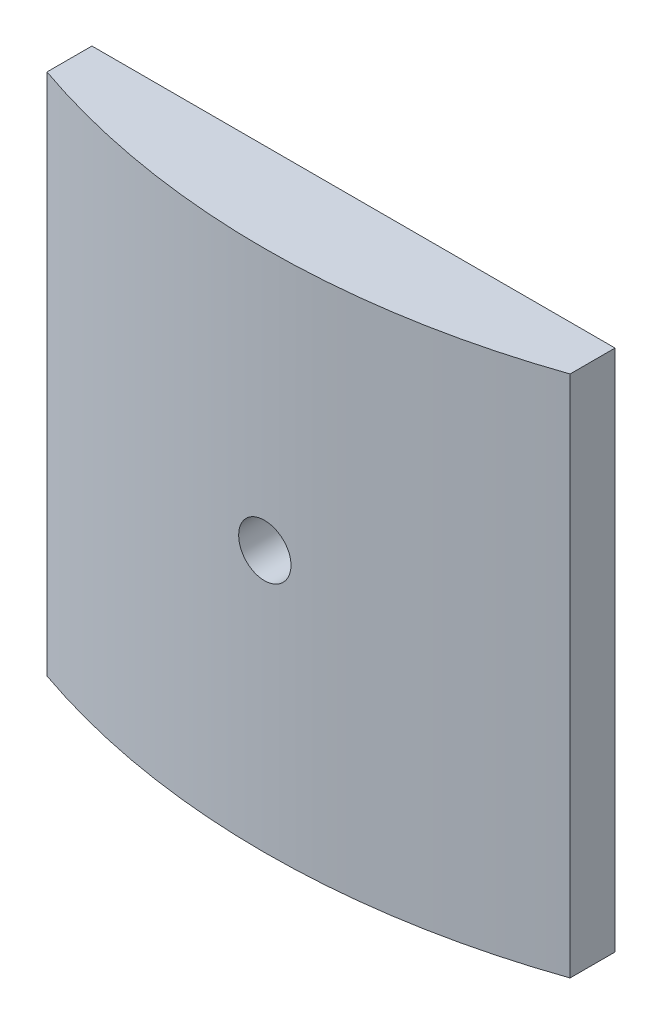
ISO-10303-21;
HEADER;
FILE_DESCRIPTION(('STEP AP214'),'2;1');
FILE_NAME('part.step','',(''),(''),'','','');
FILE_SCHEMA(('AUTOMOTIVE_DESIGN { 1 0 10303 214 1 1 1 1 }'));
ENDSEC;
DATA;
#1=APPLICATION_CONTEXT('core data for automotive mechanical design processes');
#2=APPLICATION_PROTOCOL_DEFINITION('international standard','automotive_design',2000,#1);
#3=PRODUCT_CONTEXT('',#1,'mechanical');
#4=PRODUCT('Part','Part','',(#3));
#5=PRODUCT_RELATED_PRODUCT_CATEGORY('part','',(#4));
#6=PRODUCT_DEFINITION_FORMATION('','',#4);
#7=PRODUCT_DEFINITION_CONTEXT('part definition',#1,'design');
#8=PRODUCT_DEFINITION('design','',#6,#7);
#9=PRODUCT_DEFINITION_SHAPE('','',#8);
#10=(LENGTH_UNIT() NAMED_UNIT(*) SI_UNIT(.MILLI.,.METRE.));
#11=(NAMED_UNIT(*) PLANE_ANGLE_UNIT() SI_UNIT($,.RADIAN.));
#12=(NAMED_UNIT(*) SI_UNIT($,.STERADIAN.) SOLID_ANGLE_UNIT());
#13=UNCERTAINTY_MEASURE_WITH_UNIT(LENGTH_MEASURE(1.E-05),#10,'distance_accuracy_value','');
#14=(GEOMETRIC_REPRESENTATION_CONTEXT(3) GLOBAL_UNCERTAINTY_ASSIGNED_CONTEXT((#13)) GLOBAL_UNIT_ASSIGNED_CONTEXT((#10,
#11,#12)) REPRESENTATION_CONTEXT('',''));
#15=CARTESIAN_POINT('',(0.,0.,0.));
#16=DIRECTION('',(0.,0.,1.));
#17=DIRECTION('',(1.,0.,0.));
#18=AXIS2_PLACEMENT_3D('',#15,#16,#17);
#19=CARTESIAN_POINT('',(0.,25.,33.8431677004384));
#20=DIRECTION('',(0.,0.,1.));
#21=DIRECTION('',(1.,0.,0.));
#22=AXIS2_PLACEMENT_3D('',#19,#20,#21);
#23=PLANE('',#22);
#24=CARTESIAN_POINT('',(0.,12.5,33.8431677004384));
#25=DIRECTION('',(0.,0.,-1.));
#26=DIRECTION('',(-1.,0.,0.));
#27=AXIS2_PLACEMENT_3D('',#24,#25,#26);
#28=CIRCLE('',#27,1.25);
#29=CARTESIAN_POINT('',(-1.25,12.5,33.8431677004384));
#30=VERTEX_POINT('',#29);
#31=EDGE_CURVE('E142',#30,#30,#28,.T.);
#32=ORIENTED_EDGE('',*,*,#31,.F.);
#33=EDGE_LOOP('',(#32));
#34=FACE_BOUND('',#33,.T.);
#35=DIRECTION('',(-1.,0.,0.));
#36=VECTOR('',#35,1.);
#37=CARTESIAN_POINT('',(0.,0.,33.8431677004384));
#38=LINE('',#37,#36);
#39=CARTESIAN_POINT('',(12.5,0.,33.8431677004384));
#40=VERTEX_POINT('',#39);
#41=CARTESIAN_POINT('',(-12.5,0.,33.8431677004384));
#42=VERTEX_POINT('',#41);
#43=EDGE_CURVE('E79',#40,#42,#38,.T.);
#44=ORIENTED_EDGE('',*,*,#43,.T.);
#45=DIRECTION('',(0.,-1.,0.));
#46=VECTOR('',#45,1.);
#47=CARTESIAN_POINT('',(-12.5,25.,33.8431677004384));
#48=LINE('',#47,#46);
#49=CARTESIAN_POINT('',(-12.5,25.,33.8431677004384));
#50=VERTEX_POINT('',#49);
#51=EDGE_CURVE('E11',#50,#42,#48,.T.);
#52=ORIENTED_EDGE('',*,*,#51,.F.);
#53=DIRECTION('',(1.,0.,0.));
#54=VECTOR('',#53,1.);
#55=CARTESIAN_POINT('',(0.,25.,33.8431677004384));
#56=LINE('',#55,#54);
#57=CARTESIAN_POINT('',(12.5,25.,33.8431677004384));
#58=VERTEX_POINT('',#57);
#59=EDGE_CURVE('E57',#50,#58,#56,.T.);
#60=ORIENTED_EDGE('',*,*,#59,.T.);
#61=DIRECTION('',(0.,-1.,0.));
#62=VECTOR('',#61,1.);
#63=CARTESIAN_POINT('',(12.5,25.,33.8431677004384));
#64=LINE('',#63,#62);
#65=EDGE_CURVE('E85',#58,#40,#64,.T.);
#66=ORIENTED_EDGE('',*,*,#65,.T.);
#67=EDGE_LOOP('',(#44,#52,#60,#66));
#68=FACE_BOUND('',#67,.T.);
#69=ADVANCED_FACE('F34',(#34,#68),#23,.F.);
#70=CARTESIAN_POINT('',(-12.5,25.,33.8431677004384));
#71=DIRECTION('',(1.,0.,0.));
#72=DIRECTION('',(0.,0.,-1.));
#73=AXIS2_PLACEMENT_3D('',#70,#71,#72);
#74=PLANE('',#73);
#75=DIRECTION('',(0.,0.,1.));
#76=VECTOR('',#75,1.);
#77=CARTESIAN_POINT('',(-12.5,0.,33.8431677004384));
#78=LINE('',#77,#76);
#79=CARTESIAN_POINT('',(-12.5,0.,35.9911100134464));
#80=VERTEX_POINT('',#79);
#81=EDGE_CURVE('E73',#42,#80,#78,.T.);
#82=ORIENTED_EDGE('',*,*,#81,.T.);
#83=DIRECTION('',(0.,-1.,0.));
#84=VECTOR('',#83,1.);
#85=CARTESIAN_POINT('',(-12.5,25.,35.9911100134464));
#86=LINE('',#85,#84);
#87=CARTESIAN_POINT('',(-12.5,25.,35.9911100134464));
#88=VERTEX_POINT('',#87);
#89=EDGE_CURVE('E48',#88,#80,#86,.T.);
#90=ORIENTED_EDGE('',*,*,#89,.F.);
#91=DIRECTION('',(0.,0.,1.));
#92=VECTOR('',#91,1.);
#93=CARTESIAN_POINT('',(-12.5,25.,33.8431677004384));
#94=LINE('',#93,#92);
#95=EDGE_CURVE('E93',#50,#88,#94,.T.);
#96=ORIENTED_EDGE('',*,*,#95,.F.);
#97=ORIENTED_EDGE('',*,*,#51,.T.);
#98=EDGE_LOOP('',(#82,#90,#96,#97));
#99=FACE_BOUND('',#98,.T.);
#100=ADVANCED_FACE('F126',(#99),#74,.F.);
#101=CARTESIAN_POINT('',(0.,25.,0.));
#102=DIRECTION('',(0.,-1.,0.));
#103=DIRECTION('',(0.,0.,-1.));
#104=AXIS2_PLACEMENT_3D('',#101,#102,#103);
#105=CYLINDRICAL_SURFACE('',#104,38.1);
#106=CARTESIAN_POINT('',(-1.25,12.5,38.0794892297678));
#107=CARTESIAN_POINT('',(-1.24999689344927,12.5701927734578,38.0794895063849));
#108=CARTESIAN_POINT('',(-1.24406772236094,12.6404359623947,38.079685396581));
#109=CARTESIAN_POINT('',(-1.22049813975321,12.7789864153585,38.0804479747923));
#110=CARTESIAN_POINT('',(-1.20284376004188,12.8472912689325,38.0810151050525));
#111=CARTESIAN_POINT('',(-1.15632812886405,12.9799378419878,38.0824558505276));
#112=CARTESIAN_POINT('',(-1.12747238530295,13.0442814912742,38.0833293150923));
#113=CARTESIAN_POINT('',(-1.05938109702831,13.1671935793335,38.0852841149171));
#114=CARTESIAN_POINT('',(-1.02014807690055,13.2257634180093,38.0863653996013));
#115=CARTESIAN_POINT('',(-0.932392363094115,13.3355135692366,38.0886146517612));
#116=CARTESIAN_POINT('',(-0.883865581024258,13.386690612199,38.0897826572468));
#117=CARTESIAN_POINT('',(-0.778907196717022,13.4801748595524,38.0920733630286));
#118=CARTESIAN_POINT('',(-0.722475278977218,13.5224817097561,38.0931960615141));
#119=CARTESIAN_POINT('',(-0.603295323037102,13.5970305716487,38.0952698129786));
#120=CARTESIAN_POINT('',(-0.540545980172142,13.6292704986706,38.0962208303886));
#121=CARTESIAN_POINT('',(-0.410521672323604,13.6827568195886,38.0978437043333));
#122=CARTESIAN_POINT('',(-0.343246727257202,13.7040032618634,38.0985155620966));
#123=CARTESIAN_POINT('',(-0.206106743775832,13.7348921365735,38.0995041678566));
#124=CARTESIAN_POINT('',(-0.136242654044698,13.7445387767749,38.099821044618));
#125=CARTESIAN_POINT('',(0.00411393517043274,13.7519671818899,38.1000644015011));
#126=CARTESIAN_POINT('',(0.0746064318771283,13.7497489992151,38.0999908833473));
#127=CARTESIAN_POINT('',(0.214190309590404,13.7335142656904,38.0994618472448));
#128=CARTESIAN_POINT('',(0.283282219261826,13.7195022547728,38.0990064762874));
#129=CARTESIAN_POINT('',(0.418132590407426,13.6800846398356,38.0977652221604));
#130=CARTESIAN_POINT('',(0.483891043817069,13.6546790082532,38.0969793381914));
#131=CARTESIAN_POINT('',(0.610222468469295,13.5931901210389,38.0951653725609));
#132=CARTESIAN_POINT('',(0.670794427031711,13.5571047862617,38.0941372437467));
#133=CARTESIAN_POINT('',(0.785022342438854,13.4752823652743,38.0919546466782));
#134=CARTESIAN_POINT('',(0.838678279832809,13.4295452519203,38.0908001780686));
#135=CARTESIAN_POINT('',(0.937577524429711,13.329691889258,38.0884943534772));
#136=CARTESIAN_POINT('',(0.982816854648363,13.2755717008317,38.0873429992189));
#137=CARTESIAN_POINT('',(1.0635680837801,13.1605023514975,38.0851737551116));
#138=CARTESIAN_POINT('',(1.09907998100811,13.0995531894065,38.0841558652856));
#139=CARTESIAN_POINT('',(1.15936786526613,12.9725537668527,38.0823683650203));
#140=CARTESIAN_POINT('',(1.18414372110389,12.9065034440664,38.0815987576149));
#141=CARTESIAN_POINT('',(1.22225365417844,12.7711776551496,38.0803947278455));
#142=CARTESIAN_POINT('',(1.23558776864052,12.7019021995129,38.0799603043911));
#143=CARTESIAN_POINT('',(1.2504308273659,12.5621272332675,38.0794758249499));
#144=CARTESIAN_POINT('',(1.25194528242318,12.4916283084568,38.0794255898394));
#145=CARTESIAN_POINT('',(1.24312039549198,12.3513772238387,38.0797146841326));
#146=CARTESIAN_POINT('',(1.23278107004136,12.2816250629897,38.0800540129927));
#147=CARTESIAN_POINT('',(1.2005466833781,12.1448629104064,38.0810838201937));
#148=CARTESIAN_POINT('',(1.1786541284927,12.0778523273176,38.0817742223725));
#149=CARTESIAN_POINT('',(1.12393727505231,11.9484573583007,38.0834282839864));
#150=CARTESIAN_POINT('',(1.09111294993041,11.8860729836158,38.0843919440856));
#151=CARTESIAN_POINT('',(1.01545012450859,11.7676759201583,38.0864843276862));
#152=CARTESIAN_POINT('',(0.97260791372582,11.7116656037019,38.0876131122894));
#153=CARTESIAN_POINT('',(0.878130896547097,11.6076304199389,38.0899082825431));
#154=CARTESIAN_POINT('',(0.82649606399705,11.5596055763863,38.0910746683056));
#155=CARTESIAN_POINT('',(0.715875920306643,11.4728861865969,38.0933140780645));
#156=CARTESIAN_POINT('',(0.656887821976872,11.4341951946829,38.0943870663963));
#157=CARTESIAN_POINT('',(0.533249810531847,11.3672661052514,38.0963182224865));
#158=CARTESIAN_POINT('',(0.468599911491139,11.3390279817502,38.097176390779));
#159=CARTESIAN_POINT('',(0.335486853934177,11.2938124389483,38.0985810007933));
#160=CARTESIAN_POINT('',(0.267024477202984,11.2768327201537,38.0991275061681));
#161=CARTESIAN_POINT('',(0.128218801169198,11.2546084389633,38.0998474393724));
#162=CARTESIAN_POINT('',(0.0578755045012822,11.2493638601305,38.1000208677245));
#163=CARTESIAN_POINT('',(-0.0826597307080741,11.250758994247,38.0999751017181));
#164=CARTESIAN_POINT('',(-0.152851724930558,11.2573931113618,38.0997560922297));
#165=CARTESIAN_POINT('',(-0.291125056489619,11.2823458013631,38.0989504887732));
#166=CARTESIAN_POINT('',(-0.35920638966508,11.3006643972838,38.0983638940806));
#167=CARTESIAN_POINT('',(-0.491327745402702,11.3484651926155,38.0968891843443));
#168=CARTESIAN_POINT('',(-0.555367703124306,11.3779475710873,38.0960010644644));
#169=CARTESIAN_POINT('',(-0.677587832579731,11.4472373455121,38.0940233524452));
#170=CARTESIAN_POINT('',(-0.735768212581943,11.4870443743137,38.0929337674705));
#171=CARTESIAN_POINT('',(-0.844643938026922,11.5758708482309,38.0906753452437));
#172=CARTESIAN_POINT('',(-0.895336548619527,11.6248936445502,38.0895064792611));
#173=CARTESIAN_POINT('',(-0.987786333821405,11.730768127002,38.0872212544327));
#174=CARTESIAN_POINT('',(-1.02954129435809,11.7876217473,38.0861049086509));
#175=CARTESIAN_POINT('',(-1.10293897097257,11.9075687174504,38.0840501911309));
#176=CARTESIAN_POINT('',(-1.13457476763535,11.9706662984406,38.0831119413512));
#177=CARTESIAN_POINT('',(-1.18676683586568,12.1012317784712,38.0815214076304));
#178=CARTESIAN_POINT('',(-1.20733630570789,12.1686943634719,38.0808687832118));
#179=CARTESIAN_POINT('',(-1.23136685362295,12.2804852826643,38.080097364937));
#180=CARTESIAN_POINT('',(-1.23834547727532,12.3240881636997,38.0798703066668));
#181=CARTESIAN_POINT('',(-1.24766302587708,12.411787391665,38.0795661521816));
#182=CARTESIAN_POINT('',(-1.25000195247171,12.4558837384199,38.0794890559135));
#183=CARTESIAN_POINT('',(-1.25,12.5,38.0794892297678));
#184=B_SPLINE_CURVE_WITH_KNOTS('',3,(#106,#107,#108,#109,#110,#111,#112,#113,#114,#115,#116,
#117,#118,#119,#120,#121,#122,#123,#124,#125,#126,#127,#128,#129,#130,#131,#132,#133,#134,#135,
#136,#137,#138,#139,#140,#141,#142,#143,#144,#145,#146,#147,#148,#149,#150,#151,#152,#153,#154,
#155,#156,#157,#158,#159,#160,#161,#162,#163,#164,#165,#166,#167,#168,#169,#170,#171,#172,#173,
#174,#175,#176,#177,#178,#179,#180,#181,#182,#183),.UNSPECIFIED.,.T.,.F.,(4,2,2,2,2,2,2,2,2,2,2,
2,2,2,2,2,2,2,2,2,2,2,2,2,2,2,2,2,2,2,2,2,2,2,2,2,2,2,4),(0.,0.210417289012688,
0.421085697968228,0.631650648553526,0.842164419898711,1.05277101133123,1.26338601069433,
1.47404459550628,1.6847022532704,1.89528347302246,2.10586376255282,2.31636302807069,
2.52686280281906,2.73740358506049,2.94794495941862,3.15858556673856,3.36922621054749,
3.57986942826986,3.7905119606694,4.00105627729577,4.21160030018056,4.42209866696288,
4.63259754531225,4.84317451330589,5.05375210768233,5.26440976369969,5.47506689606269,
5.68568098910191,5.89629478714134,6.10680939500792,6.31732441787244,6.52784281741967,
6.73835373181774,6.94894134459004,7.15958106479881,7.3703645126145,7.58089600871995,
7.71314363190767,7.84539120820048),.UNSPECIFIED.);
#185=CARTESIAN_POINT('',(-1.25,12.5,38.0794892297678));
#186=VERTEX_POINT('',#185);
#187=EDGE_CURVE('E38',#186,#186,#184,.T.);
#188=ORIENTED_EDGE('',*,*,#187,.T.);
#189=EDGE_LOOP('',(#188));
#190=FACE_BOUND('',#189,.T.);
#191=CARTESIAN_POINT('',(0.,0.,0.));
#192=DIRECTION('',(0.,1.,0.));
#193=DIRECTION('',(0.,0.,1.));
#194=AXIS2_PLACEMENT_3D('',#191,#192,#193);
#195=CIRCLE('',#194,38.1);
#196=CARTESIAN_POINT('',(12.5,0.,35.9911100134464));
#197=VERTEX_POINT('',#196);
#198=EDGE_CURVE('E100',#80,#197,#195,.T.);
#199=ORIENTED_EDGE('',*,*,#198,.T.);
#200=DIRECTION('',(0.,-1.,0.));
#201=VECTOR('',#200,1.);
#202=CARTESIAN_POINT('',(12.5,25.,35.9911100134464));
#203=LINE('',#202,#201);
#204=CARTESIAN_POINT('',(12.5,25.,35.9911100134464));
#205=VERTEX_POINT('',#204);
#206=EDGE_CURVE('E97',#205,#197,#203,.T.);
#207=ORIENTED_EDGE('',*,*,#206,.F.);
#208=CARTESIAN_POINT('',(0.,25.,0.));
#209=DIRECTION('',(0.,1.,0.));
#210=DIRECTION('',(0.,0.,1.));
#211=AXIS2_PLACEMENT_3D('',#208,#209,#210);
#212=CIRCLE('',#211,38.1);
#213=EDGE_CURVE('E88',#88,#205,#212,.T.);
#214=ORIENTED_EDGE('',*,*,#213,.F.);
#215=ORIENTED_EDGE('',*,*,#89,.T.);
#216=EDGE_LOOP('',(#199,#207,#214,#215));
#217=FACE_BOUND('',#216,.T.);
#218=ADVANCED_FACE('F98',(#190,#217),#105,.T.);
#219=CARTESIAN_POINT('',(12.5,25.,33.8431677004384));
#220=DIRECTION('',(1.,0.,0.));
#221=DIRECTION('',(0.,0.,-1.));
#222=AXIS2_PLACEMENT_3D('',#219,#220,#221);
#223=PLANE('',#222);
#224=DIRECTION('',(0.,0.,1.));
#225=VECTOR('',#224,1.);
#226=CARTESIAN_POINT('',(12.5,0.,33.8431677004384));
#227=LINE('',#226,#225);
#228=EDGE_CURVE('E108',#40,#197,#227,.T.);
#229=ORIENTED_EDGE('',*,*,#228,.F.);
#230=ORIENTED_EDGE('',*,*,#65,.F.);
#231=DIRECTION('',(0.,0.,1.));
#232=VECTOR('',#231,1.);
#233=CARTESIAN_POINT('',(12.5,25.,33.8431677004384));
#234=LINE('',#233,#232);
#235=EDGE_CURVE('E91',#58,#205,#234,.T.);
#236=ORIENTED_EDGE('',*,*,#235,.T.);
#237=ORIENTED_EDGE('',*,*,#206,.T.);
#238=EDGE_LOOP('',(#229,#230,#236,#237));
#239=FACE_BOUND('',#238,.T.);
#240=ADVANCED_FACE('F36',(#239),#223,.T.);
#241=CARTESIAN_POINT('',(0.,25.,0.));
#242=DIRECTION('',(0.,1.,0.));
#243=DIRECTION('',(0.,0.,1.));
#244=AXIS2_PLACEMENT_3D('',#241,#242,#243);
#245=PLANE('',#244);
#246=ORIENTED_EDGE('',*,*,#59,.F.);
#247=ORIENTED_EDGE('',*,*,#95,.T.);
#248=ORIENTED_EDGE('',*,*,#213,.T.);
#249=ORIENTED_EDGE('',*,*,#235,.F.);
#250=EDGE_LOOP('',(#246,#247,#248,#249));
#251=FACE_BOUND('',#250,.T.);
#252=ADVANCED_FACE('F90',(#251),#245,.T.);
#253=CARTESIAN_POINT('',(0.,0.,0.));
#254=DIRECTION('',(0.,1.,0.));
#255=DIRECTION('',(0.,0.,1.));
#256=AXIS2_PLACEMENT_3D('',#253,#254,#255);
#257=PLANE('',#256);
#258=ORIENTED_EDGE('',*,*,#43,.F.);
#259=ORIENTED_EDGE('',*,*,#228,.T.);
#260=ORIENTED_EDGE('',*,*,#198,.F.);
#261=ORIENTED_EDGE('',*,*,#81,.F.);
#262=EDGE_LOOP('',(#258,#259,#260,#261));
#263=FACE_BOUND('',#262,.T.);
#264=ADVANCED_FACE('F114',(#263),#257,.F.);
#265=CARTESIAN_POINT('',(0.,12.5,53.8431677004384));
#266=DIRECTION('',(0.,0.,-1.));
#267=DIRECTION('',(-1.,0.,0.));
#268=AXIS2_PLACEMENT_3D('',#265,#266,#267);
#269=CYLINDRICAL_SURFACE('',#268,1.25);
#270=ORIENTED_EDGE('',*,*,#31,.T.);
#271=EDGE_LOOP('',(#270));
#272=FACE_BOUND('',#271,.T.);
#273=ORIENTED_EDGE('',*,*,#187,.F.);
#274=EDGE_LOOP('',(#273));
#275=FACE_BOUND('',#274,.T.);
#276=ADVANCED_FACE('F116',(#272,#275),#269,.F.);
#277=CLOSED_SHELL('',(#69,#100,#218,#240,#252,#264,#276));
#278=MANIFOLD_SOLID_BREP('B2',#277);
#279=ADVANCED_BREP_SHAPE_REPRESENTATION('',(#18,#278),#14);
#280=SHAPE_DEFINITION_REPRESENTATION(#9,#279);
ENDSEC;
END-ISO-10303-21;
